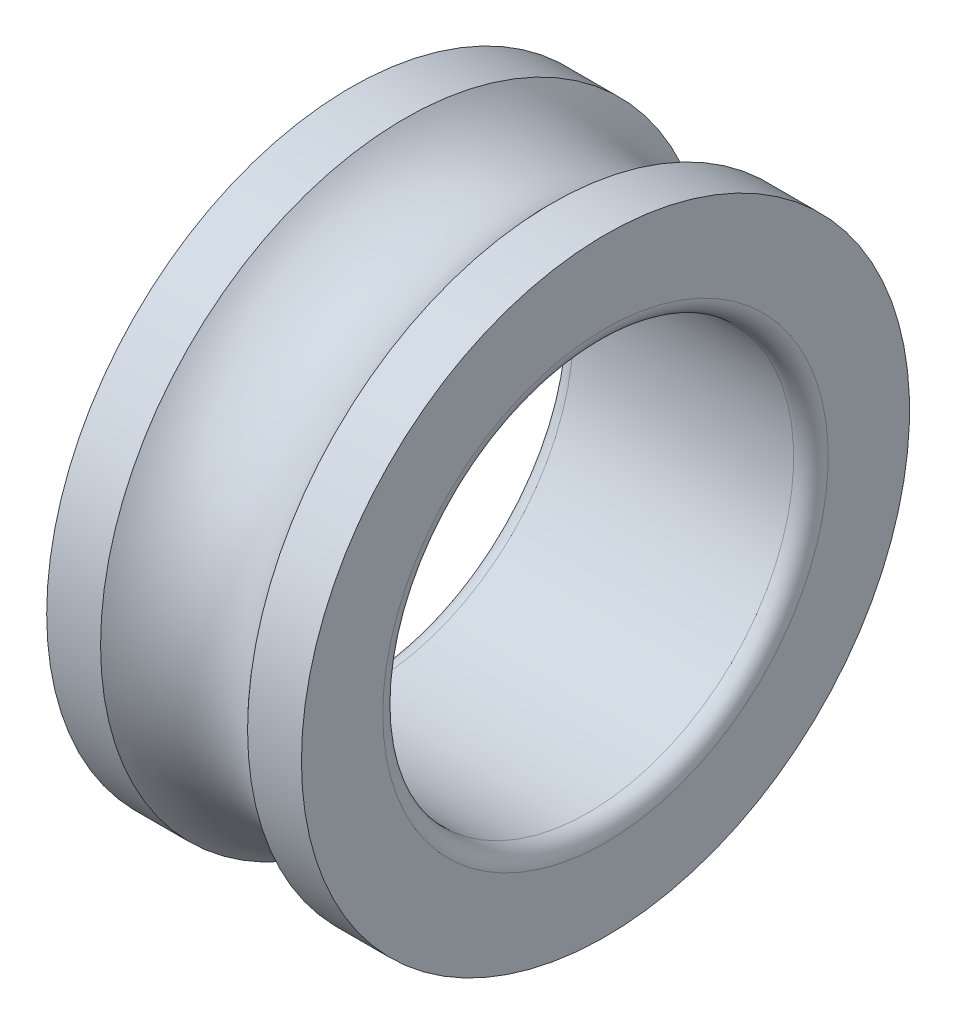
ISO-10303-21;
HEADER;
FILE_DESCRIPTION(('STEP AP214'),'2;1');
FILE_NAME('part.step','',(''),(''),'','','');
FILE_SCHEMA(('AUTOMOTIVE_DESIGN { 1 0 10303 214 1 1 1 1 }'));
ENDSEC;
DATA;
#1=APPLICATION_CONTEXT('core data for automotive mechanical design processes');
#2=APPLICATION_PROTOCOL_DEFINITION('international standard','automotive_design',2000,#1);
#3=PRODUCT_CONTEXT('',#1,'mechanical');
#4=PRODUCT('Part','Part','',(#3));
#5=PRODUCT_RELATED_PRODUCT_CATEGORY('part','',(#4));
#6=PRODUCT_DEFINITION_FORMATION('','',#4);
#7=PRODUCT_DEFINITION_CONTEXT('part definition',#1,'design');
#8=PRODUCT_DEFINITION('design','',#6,#7);
#9=PRODUCT_DEFINITION_SHAPE('','',#8);
#10=(LENGTH_UNIT() NAMED_UNIT(*) SI_UNIT(.MILLI.,.METRE.));
#11=(NAMED_UNIT(*) PLANE_ANGLE_UNIT() SI_UNIT($,.RADIAN.));
#12=(NAMED_UNIT(*) SI_UNIT($,.STERADIAN.) SOLID_ANGLE_UNIT());
#13=UNCERTAINTY_MEASURE_WITH_UNIT(LENGTH_MEASURE(1.E-05),#10,'distance_accuracy_value','');
#14=(GEOMETRIC_REPRESENTATION_CONTEXT(3) GLOBAL_UNCERTAINTY_ASSIGNED_CONTEXT((#13)) GLOBAL_UNIT_ASSIGNED_CONTEXT((#10,
#11,#12)) REPRESENTATION_CONTEXT('',''));
#15=CARTESIAN_POINT('',(0.,0.,0.));
#16=DIRECTION('',(0.,0.,1.));
#17=DIRECTION('',(1.,0.,0.));
#18=AXIS2_PLACEMENT_3D('',#15,#16,#17);
#19=CARTESIAN_POINT('',(15.5,37.,0.));
#20=DIRECTION('',(-1.,0.,0.));
#21=DIRECTION('',(0.,0.,1.));
#22=AXIS2_PLACEMENT_3D('',#19,#20,#21);
#23=PLANE('',#22);
#24=CARTESIAN_POINT('',(15.5,0.,0.));
#25=DIRECTION('',(-1.,0.,0.));
#26=DIRECTION('',(0.,0.,1.));
#27=AXIS2_PLACEMENT_3D('',#24,#25,#26);
#28=CIRCLE('',#27,37.);
#29=CARTESIAN_POINT('',(15.5,0.,37.));
#30=VERTEX_POINT('',#29);
#31=EDGE_CURVE('E74',#30,#30,#28,.T.);
#32=ORIENTED_EDGE('',*,*,#31,.F.);
#33=EDGE_LOOP('',(#32));
#34=FACE_BOUND('',#33,.T.);
#35=CARTESIAN_POINT('',(15.5,0.,0.));
#36=DIRECTION('',(-1.,0.,0.));
#37=DIRECTION('',(0.,0.,1.));
#38=AXIS2_PLACEMENT_3D('',#35,#36,#37);
#39=CIRCLE('',#38,27.1);
#40=CARTESIAN_POINT('',(15.5,0.,27.1));
#41=VERTEX_POINT('',#40);
#42=EDGE_CURVE('E10',#41,#41,#39,.T.);
#43=ORIENTED_EDGE('',*,*,#42,.T.);
#44=EDGE_LOOP('',(#43));
#45=FACE_BOUND('',#44,.T.);
#46=ADVANCED_FACE('F39',(#34,#45),#23,.F.);
#47=CARTESIAN_POINT('',(13.4,0.,0.));
#48=DIRECTION('',(-1.,0.,0.));
#49=DIRECTION('',(0.,0.,1.));
#50=AXIS2_PLACEMENT_3D('',#47,#48,#49);
#51=TOROIDAL_SURFACE('',#50,27.1,2.1);
#52=ORIENTED_EDGE('',*,*,#42,.F.);
#53=EDGE_LOOP('',(#52));
#54=FACE_BOUND('',#53,.T.);
#55=CARTESIAN_POINT('',(13.4,0.,0.));
#56=DIRECTION('',(-1.,0.,0.));
#57=DIRECTION('',(0.,0.,1.));
#58=AXIS2_PLACEMENT_3D('',#55,#56,#57);
#59=CIRCLE('',#58,25.);
#60=CARTESIAN_POINT('',(13.4,0.,25.));
#61=VERTEX_POINT('',#60);
#62=EDGE_CURVE('E46',#61,#61,#59,.T.);
#63=ORIENTED_EDGE('',*,*,#62,.T.);
#64=EDGE_LOOP('',(#63));
#65=FACE_BOUND('',#64,.T.);
#66=ADVANCED_FACE('F82',(#54,#65),#51,.T.);
#67=CARTESIAN_POINT('',(-21.7042349726776,0.,0.));
#68=DIRECTION('',(-1.,0.,0.));
#69=DIRECTION('',(0.,0.,1.));
#70=AXIS2_PLACEMENT_3D('',#67,#68,#69);
#71=CYLINDRICAL_SURFACE('',#70,25.);
#72=ORIENTED_EDGE('',*,*,#62,.F.);
#73=EDGE_LOOP('',(#72));
#74=FACE_BOUND('',#73,.T.);
#75=CARTESIAN_POINT('',(-13.4,0.,0.));
#76=DIRECTION('',(-1.,0.,0.));
#77=DIRECTION('',(0.,0.,1.));
#78=AXIS2_PLACEMENT_3D('',#75,#76,#77);
#79=CIRCLE('',#78,25.);
#80=CARTESIAN_POINT('',(-13.4,0.,25.));
#81=VERTEX_POINT('',#80);
#82=EDGE_CURVE('E51',#81,#81,#79,.T.);
#83=ORIENTED_EDGE('',*,*,#82,.T.);
#84=EDGE_LOOP('',(#83));
#85=FACE_BOUND('',#84,.T.);
#86=ADVANCED_FACE('F86',(#74,#85),#71,.F.);
#87=CARTESIAN_POINT('',(-13.4,0.,0.));
#88=DIRECTION('',(-1.,0.,0.));
#89=DIRECTION('',(0.,0.,1.));
#90=AXIS2_PLACEMENT_3D('',#87,#88,#89);
#91=TOROIDAL_SURFACE('',#90,27.1,2.1);
#92=ORIENTED_EDGE('',*,*,#82,.F.);
#93=EDGE_LOOP('',(#92));
#94=FACE_BOUND('',#93,.T.);
#95=CARTESIAN_POINT('',(-15.5,0.,0.));
#96=DIRECTION('',(-1.,0.,0.));
#97=DIRECTION('',(0.,0.,1.));
#98=AXIS2_PLACEMENT_3D('',#95,#96,#97);
#99=CIRCLE('',#98,27.1);
#100=CARTESIAN_POINT('',(-15.5,0.,27.1));
#101=VERTEX_POINT('',#100);
#102=EDGE_CURVE('E56',#101,#101,#99,.T.);
#103=ORIENTED_EDGE('',*,*,#102,.T.);
#104=EDGE_LOOP('',(#103));
#105=FACE_BOUND('',#104,.T.);
#106=ADVANCED_FACE('F91',(#94,#105),#91,.T.);
#107=CARTESIAN_POINT('',(-15.5,37.,0.));
#108=DIRECTION('',(1.,0.,0.));
#109=DIRECTION('',(0.,0.,-1.));
#110=AXIS2_PLACEMENT_3D('',#107,#108,#109);
#111=PLANE('',#110);
#112=ORIENTED_EDGE('',*,*,#102,.F.);
#113=EDGE_LOOP('',(#112));
#114=FACE_BOUND('',#113,.T.);
#115=CARTESIAN_POINT('',(-15.5,0.,0.));
#116=DIRECTION('',(-1.,0.,0.));
#117=DIRECTION('',(0.,0.,1.));
#118=AXIS2_PLACEMENT_3D('',#115,#116,#117);
#119=CIRCLE('',#118,37.);
#120=CARTESIAN_POINT('',(-15.5,0.,37.));
#121=VERTEX_POINT('',#120);
#122=EDGE_CURVE('E62',#121,#121,#119,.T.);
#123=ORIENTED_EDGE('',*,*,#122,.T.);
#124=EDGE_LOOP('',(#123));
#125=FACE_BOUND('',#124,.T.);
#126=ADVANCED_FACE('F97',(#114,#125),#111,.F.);
#127=CARTESIAN_POINT('',(-21.7042349726776,0.,0.));
#128=DIRECTION('',(-1.,0.,0.));
#129=DIRECTION('',(0.,0.,1.));
#130=AXIS2_PLACEMENT_3D('',#127,#128,#129);
#131=CYLINDRICAL_SURFACE('',#130,37.);
#132=ORIENTED_EDGE('',*,*,#122,.F.);
#133=EDGE_LOOP('',(#132));
#134=FACE_BOUND('',#133,.T.);
#135=CARTESIAN_POINT('',(-8.94427190999916,0.,0.));
#136=DIRECTION('',(-1.,0.,0.));
#137=DIRECTION('',(0.,0.,1.));
#138=AXIS2_PLACEMENT_3D('',#135,#136,#137);
#139=CIRCLE('',#138,37.);
#140=CARTESIAN_POINT('',(-8.94427190999916,0.,37.));
#141=VERTEX_POINT('',#140);
#142=EDGE_CURVE('E66',#141,#141,#139,.T.);
#143=ORIENTED_EDGE('',*,*,#142,.T.);
#144=EDGE_LOOP('',(#143));
#145=FACE_BOUND('',#144,.T.);
#146=ADVANCED_FACE('F101',(#134,#145),#131,.T.);
#147=CARTESIAN_POINT('',(0.,0.,0.));
#148=DIRECTION('',(-1.,0.,0.));
#149=DIRECTION('',(0.,0.,1.));
#150=AXIS2_PLACEMENT_3D('',#147,#148,#149);
#151=TOROIDAL_SURFACE('',#150,45.,12.);
#152=ORIENTED_EDGE('',*,*,#142,.F.);
#153=EDGE_LOOP('',(#152));
#154=FACE_BOUND('',#153,.T.);
#155=CARTESIAN_POINT('',(8.94427190999916,0.,0.));
#156=DIRECTION('',(-1.,0.,0.));
#157=DIRECTION('',(0.,0.,1.));
#158=AXIS2_PLACEMENT_3D('',#155,#156,#157);
#159=CIRCLE('',#158,37.);
#160=CARTESIAN_POINT('',(8.94427190999916,0.,37.));
#161=VERTEX_POINT('',#160);
#162=EDGE_CURVE('E70',#161,#161,#159,.T.);
#163=ORIENTED_EDGE('',*,*,#162,.T.);
#164=EDGE_LOOP('',(#163));
#165=FACE_BOUND('',#164,.T.);
#166=ADVANCED_FACE('F105',(#154,#165),#151,.F.);
#167=CARTESIAN_POINT('',(-21.7042349726776,0.,0.));
#168=DIRECTION('',(-1.,0.,0.));
#169=DIRECTION('',(0.,0.,1.));
#170=AXIS2_PLACEMENT_3D('',#167,#168,#169);
#171=CYLINDRICAL_SURFACE('',#170,37.);
#172=ORIENTED_EDGE('',*,*,#162,.F.);
#173=EDGE_LOOP('',(#172));
#174=FACE_BOUND('',#173,.T.);
#175=ORIENTED_EDGE('',*,*,#31,.T.);
#176=EDGE_LOOP('',(#175));
#177=FACE_BOUND('',#176,.T.);
#178=ADVANCED_FACE('F79',(#174,#177),#171,.T.);
#179=CLOSED_SHELL('',(#46,#66,#86,#106,#126,#146,#166,#178));
#180=MANIFOLD_SOLID_BREP('B2',#179);
#181=ADVANCED_BREP_SHAPE_REPRESENTATION('',(#18,#180),#14);
#182=SHAPE_DEFINITION_REPRESENTATION(#9,#181);
ENDSEC;
END-ISO-10303-21;
